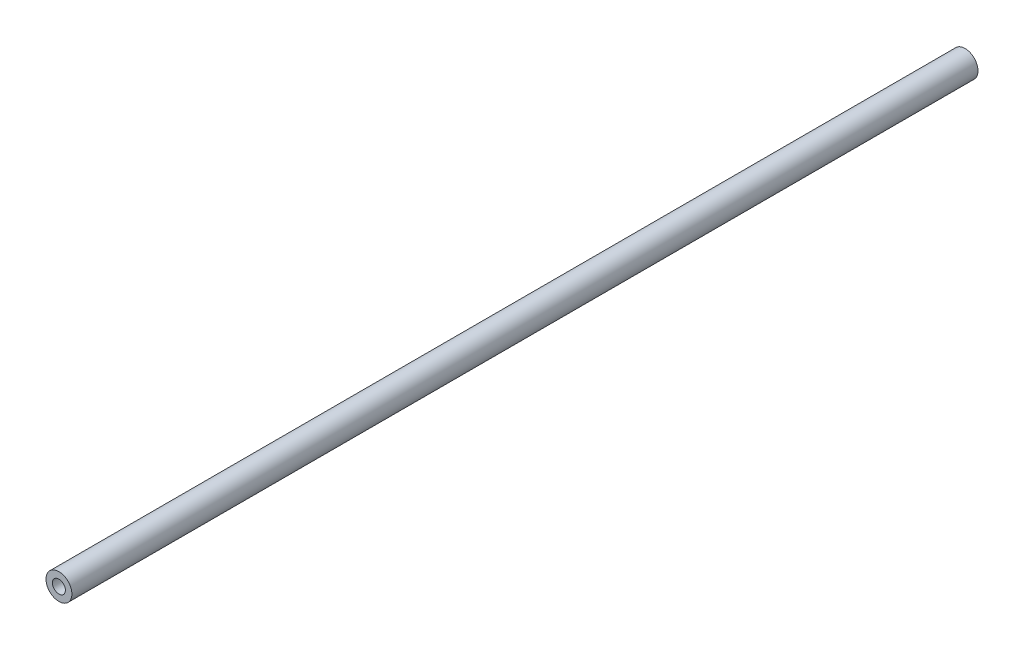
ISO-10303-21;
HEADER;
FILE_DESCRIPTION(('STEP AP214'),'2;1');
FILE_NAME('part.step','',(''),(''),'','','');
FILE_SCHEMA(('AUTOMOTIVE_DESIGN { 1 0 10303 214 1 1 1 1 }'));
ENDSEC;
DATA;
#1=APPLICATION_CONTEXT('core data for automotive mechanical design processes');
#2=APPLICATION_PROTOCOL_DEFINITION('international standard','automotive_design',2000,#1);
#3=PRODUCT_CONTEXT('',#1,'mechanical');
#4=PRODUCT('Part','Part','',(#3));
#5=PRODUCT_RELATED_PRODUCT_CATEGORY('part','',(#4));
#6=PRODUCT_DEFINITION_FORMATION('','',#4);
#7=PRODUCT_DEFINITION_CONTEXT('part definition',#1,'design');
#8=PRODUCT_DEFINITION('design','',#6,#7);
#9=PRODUCT_DEFINITION_SHAPE('','',#8);
#10=(LENGTH_UNIT() NAMED_UNIT(*) SI_UNIT(.MILLI.,.METRE.));
#11=(NAMED_UNIT(*) PLANE_ANGLE_UNIT() SI_UNIT($,.RADIAN.));
#12=(NAMED_UNIT(*) SI_UNIT($,.STERADIAN.) SOLID_ANGLE_UNIT());
#13=UNCERTAINTY_MEASURE_WITH_UNIT(LENGTH_MEASURE(1.E-05),#10,'distance_accuracy_value','');
#14=(GEOMETRIC_REPRESENTATION_CONTEXT(3) GLOBAL_UNCERTAINTY_ASSIGNED_CONTEXT((#13)) GLOBAL_UNIT_ASSIGNED_CONTEXT((#10,
#11,#12)) REPRESENTATION_CONTEXT('',''));
#15=CARTESIAN_POINT('',(0.,0.,0.));
#16=DIRECTION('',(0.,0.,1.));
#17=DIRECTION('',(1.,0.,0.));
#18=AXIS2_PLACEMENT_3D('',#15,#16,#17);
#19=CARTESIAN_POINT('',(0.,0.,280.));
#20=DIRECTION('',(0.,0.,-1.));
#21=DIRECTION('',(-1.,0.,0.));
#22=AXIS2_PLACEMENT_3D('',#19,#20,#21);
#23=CYLINDRICAL_SURFACE('',#22,4.);
#24=CARTESIAN_POINT('',(0.,0.,280.));
#25=DIRECTION('',(0.,0.,1.));
#26=DIRECTION('',(1.,0.,0.));
#27=AXIS2_PLACEMENT_3D('',#24,#25,#26);
#28=CIRCLE('',#27,4.);
#29=CARTESIAN_POINT('',(4.,0.,280.));
#30=VERTEX_POINT('',#29);
#31=EDGE_CURVE('E10',#30,#30,#28,.T.);
#32=ORIENTED_EDGE('',*,*,#31,.F.);
#33=EDGE_LOOP('',(#32));
#34=FACE_BOUND('',#33,.T.);
#35=CARTESIAN_POINT('',(0.,0.,0.));
#36=DIRECTION('',(0.,0.,1.));
#37=DIRECTION('',(1.,0.,0.));
#38=AXIS2_PLACEMENT_3D('',#35,#36,#37);
#39=CIRCLE('',#38,4.);
#40=CARTESIAN_POINT('',(4.,0.,0.));
#41=VERTEX_POINT('',#40);
#42=EDGE_CURVE('E42',#41,#41,#39,.T.);
#43=ORIENTED_EDGE('',*,*,#42,.T.);
#44=EDGE_LOOP('',(#43));
#45=FACE_BOUND('',#44,.T.);
#46=ADVANCED_FACE('F39',(#34,#45),#23,.T.);
#47=CARTESIAN_POINT('',(0.,0.,280.));
#48=DIRECTION('',(0.,0.,1.));
#49=DIRECTION('',(1.,0.,0.));
#50=AXIS2_PLACEMENT_3D('',#47,#48,#49);
#51=PLANE('',#50);
#52=CARTESIAN_POINT('',(0.,0.,280.));
#53=DIRECTION('',(0.,0.,1.));
#54=DIRECTION('',(1.,0.,0.));
#55=AXIS2_PLACEMENT_3D('',#52,#53,#54);
#56=CIRCLE('',#55,2.);
#57=CARTESIAN_POINT('',(2.,0.,280.));
#58=VERTEX_POINT('',#57);
#59=EDGE_CURVE('E51',#58,#58,#56,.T.);
#60=ORIENTED_EDGE('',*,*,#59,.F.);
#61=EDGE_LOOP('',(#60));
#62=FACE_BOUND('',#61,.T.);
#63=ORIENTED_EDGE('',*,*,#31,.T.);
#64=EDGE_LOOP('',(#63));
#65=FACE_BOUND('',#64,.T.);
#66=ADVANCED_FACE('F76',(#62,#65),#51,.T.);
#67=CARTESIAN_POINT('',(0.,0.,0.));
#68=DIRECTION('',(0.,0.,1.));
#69=DIRECTION('',(1.,0.,0.));
#70=AXIS2_PLACEMENT_3D('',#67,#68,#69);
#71=PLANE('',#70);
#72=CARTESIAN_POINT('',(0.,0.,0.));
#73=DIRECTION('',(0.,0.,-1.));
#74=DIRECTION('',(-1.,0.,0.));
#75=AXIS2_PLACEMENT_3D('',#72,#73,#74);
#76=CIRCLE('',#75,2.);
#77=CARTESIAN_POINT('',(-2.,0.,0.));
#78=VERTEX_POINT('',#77);
#79=EDGE_CURVE('E57',#78,#78,#76,.T.);
#80=ORIENTED_EDGE('',*,*,#79,.F.);
#81=EDGE_LOOP('',(#80));
#82=FACE_BOUND('',#81,.T.);
#83=ORIENTED_EDGE('',*,*,#42,.F.);
#84=EDGE_LOOP('',(#83));
#85=FACE_BOUND('',#84,.T.);
#86=ADVANCED_FACE('F72',(#82,#85),#71,.F.);
#87=CARTESIAN_POINT('',(0.,0.,270.));
#88=DIRECTION('',(0.,0.,1.));
#89=DIRECTION('',(1.,0.,0.));
#90=AXIS2_PLACEMENT_3D('',#87,#88,#89);
#91=CYLINDRICAL_SURFACE('',#90,2.);
#92=CARTESIAN_POINT('',(0.,0.,270.));
#93=DIRECTION('',(0.,0.,1.));
#94=DIRECTION('',(1.,0.,0.));
#95=AXIS2_PLACEMENT_3D('',#92,#93,#94);
#96=CIRCLE('',#95,2.);
#97=CARTESIAN_POINT('',(2.,0.,270.));
#98=VERTEX_POINT('',#97);
#99=EDGE_CURVE('E49',#98,#98,#96,.T.);
#100=ORIENTED_EDGE('',*,*,#99,.F.);
#101=EDGE_LOOP('',(#100));
#102=FACE_BOUND('',#101,.T.);
#103=ORIENTED_EDGE('',*,*,#59,.T.);
#104=EDGE_LOOP('',(#103));
#105=FACE_BOUND('',#104,.T.);
#106=ADVANCED_FACE('F75',(#102,#105),#91,.F.);
#107=CARTESIAN_POINT('',(0.,0.,270.));
#108=DIRECTION('',(0.,0.,1.));
#109=DIRECTION('',(1.,0.,0.));
#110=AXIS2_PLACEMENT_3D('',#107,#108,#109);
#111=PLANE('',#110);
#112=ORIENTED_EDGE('',*,*,#99,.T.);
#113=EDGE_LOOP('',(#112));
#114=FACE_BOUND('',#113,.T.);
#115=ADVANCED_FACE('F68',(#114),#111,.T.);
#116=CARTESIAN_POINT('',(0.,0.,10.));
#117=DIRECTION('',(0.,0.,-1.));
#118=DIRECTION('',(-1.,0.,0.));
#119=AXIS2_PLACEMENT_3D('',#116,#117,#118);
#120=CYLINDRICAL_SURFACE('',#119,2.);
#121=CARTESIAN_POINT('',(0.,0.,10.));
#122=DIRECTION('',(0.,0.,-1.));
#123=DIRECTION('',(-1.,0.,0.));
#124=AXIS2_PLACEMENT_3D('',#121,#122,#123);
#125=CIRCLE('',#124,2.);
#126=CARTESIAN_POINT('',(-2.,0.,10.));
#127=VERTEX_POINT('',#126);
#128=EDGE_CURVE('E54',#127,#127,#125,.T.);
#129=ORIENTED_EDGE('',*,*,#128,.F.);
#130=EDGE_LOOP('',(#129));
#131=FACE_BOUND('',#130,.T.);
#132=ORIENTED_EDGE('',*,*,#79,.T.);
#133=EDGE_LOOP('',(#132));
#134=FACE_BOUND('',#133,.T.);
#135=ADVANCED_FACE('F65',(#131,#134),#120,.F.);
#136=CARTESIAN_POINT('',(0.,0.,10.));
#137=DIRECTION('',(0.,0.,-1.));
#138=DIRECTION('',(-1.,0.,0.));
#139=AXIS2_PLACEMENT_3D('',#136,#137,#138);
#140=PLANE('',#139);
#141=ORIENTED_EDGE('',*,*,#128,.T.);
#142=EDGE_LOOP('',(#141));
#143=FACE_BOUND('',#142,.T.);
#144=ADVANCED_FACE('F63',(#143),#140,.T.);
#145=CLOSED_SHELL('',(#46,#66,#86,#106,#115,#135,#144));
#146=MANIFOLD_SOLID_BREP('B2',#145);
#147=ADVANCED_BREP_SHAPE_REPRESENTATION('',(#18,#146),#14);
#148=SHAPE_DEFINITION_REPRESENTATION(#9,#147);
ENDSEC;
END-ISO-10303-21;
